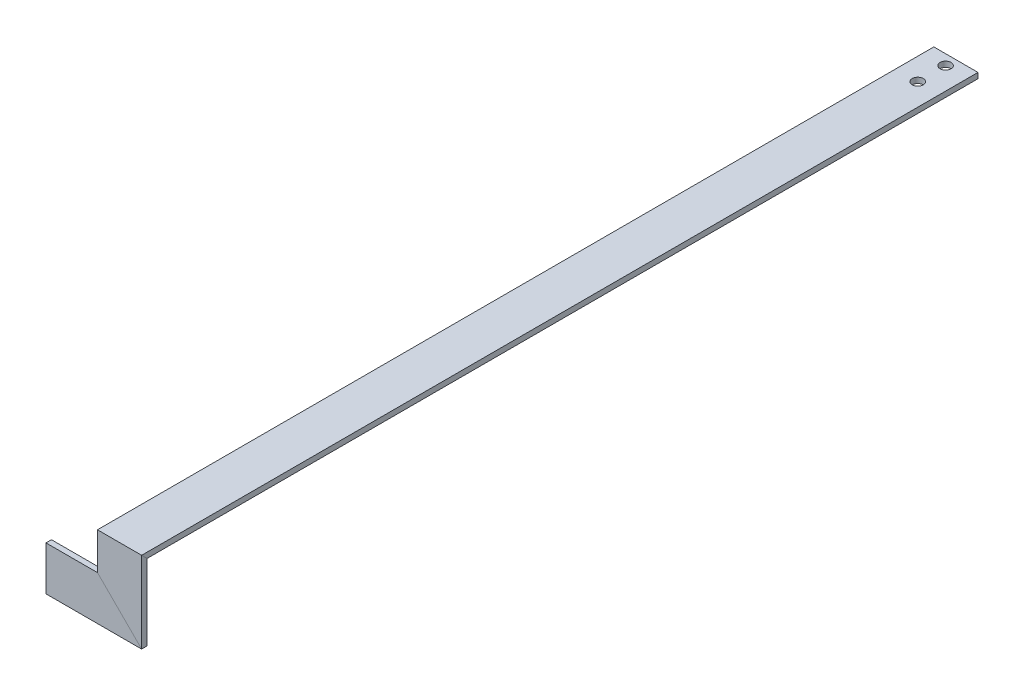
ISO-10303-21;
HEADER;
FILE_DESCRIPTION(('STEP AP214'),'2;1');
FILE_NAME('part.step','',(''),(''),'','','');
FILE_SCHEMA(('AUTOMOTIVE_DESIGN { 1 0 10303 214 1 1 1 1 }'));
ENDSEC;
DATA;
#1=APPLICATION_CONTEXT('core data for automotive mechanical design processes');
#2=APPLICATION_PROTOCOL_DEFINITION('international standard','automotive_design',2000,#1);
#3=PRODUCT_CONTEXT('',#1,'mechanical');
#4=PRODUCT('Part','Part','',(#3));
#5=PRODUCT_RELATED_PRODUCT_CATEGORY('part','',(#4));
#6=PRODUCT_DEFINITION_FORMATION('','',#4);
#7=PRODUCT_DEFINITION_CONTEXT('part definition',#1,'design');
#8=PRODUCT_DEFINITION('design','',#6,#7);
#9=PRODUCT_DEFINITION_SHAPE('','',#8);
#10=(LENGTH_UNIT() NAMED_UNIT(*) SI_UNIT(.MILLI.,.METRE.));
#11=(NAMED_UNIT(*) PLANE_ANGLE_UNIT() SI_UNIT($,.RADIAN.));
#12=(NAMED_UNIT(*) SI_UNIT($,.STERADIAN.) SOLID_ANGLE_UNIT());
#13=UNCERTAINTY_MEASURE_WITH_UNIT(LENGTH_MEASURE(1.E-05),#10,'distance_accuracy_value','');
#14=(GEOMETRIC_REPRESENTATION_CONTEXT(3) GLOBAL_UNCERTAINTY_ASSIGNED_CONTEXT((#13)) GLOBAL_UNIT_ASSIGNED_CONTEXT((#10,
#11,#12)) REPRESENTATION_CONTEXT('',''));
#15=CARTESIAN_POINT('',(0.,0.,0.));
#16=DIRECTION('',(0.,0.,1.));
#17=DIRECTION('',(1.,0.,0.));
#18=AXIS2_PLACEMENT_3D('',#15,#16,#17);
#19=CARTESIAN_POINT('',(-84.5999999999998,-64.9,958.84));
#20=DIRECTION('',(-1.,0.,0.));
#21=DIRECTION('',(0.,-1.,0.));
#22=AXIS2_PLACEMENT_3D('',#19,#20,#21);
#23=PLANE('',#22);
#24=DIRECTION('',(0.,0.,1.));
#25=VECTOR('',#24,1.);
#26=CARTESIAN_POINT('',(-84.5999999999998,-90.3,961.995));
#27=LINE('',#26,#25);
#28=CARTESIAN_POINT('',(-84.5999999999998,-90.3,955.685));
#29=VERTEX_POINT('',#28);
#30=CARTESIAN_POINT('',(-84.5999999999998,-90.3,961.995));
#31=VERTEX_POINT('',#30);
#32=EDGE_CURVE('E84',#29,#31,#27,.T.);
#33=ORIENTED_EDGE('',*,*,#32,.T.);
#34=DIRECTION('',(0.,1.,0.));
#35=VECTOR('',#34,1.);
#36=CARTESIAN_POINT('',(-84.5999999999998,-39.5,961.995));
#37=LINE('',#36,#35);
#38=CARTESIAN_POINT('',(-84.5999999999998,-39.5,961.995));
#39=VERTEX_POINT('',#38);
#40=EDGE_CURVE('E82',#31,#39,#37,.T.);
#41=ORIENTED_EDGE('',*,*,#40,.T.);
#42=DIRECTION('',(0.,0.,-1.));
#43=VECTOR('',#42,1.);
#44=CARTESIAN_POINT('',(-84.5999999999998,-39.5,961.995));
#45=LINE('',#44,#43);
#46=CARTESIAN_POINT('',(-84.5999999999998,-39.5,955.685));
#47=VERTEX_POINT('',#46);
#48=EDGE_CURVE('E79',#39,#47,#45,.T.);
#49=ORIENTED_EDGE('',*,*,#48,.T.);
#50=DIRECTION('',(0.,-1.,0.));
#51=VECTOR('',#50,1.);
#52=CARTESIAN_POINT('',(-84.5999999999998,-39.5,955.685));
#53=LINE('',#52,#51);
#54=EDGE_CURVE('E99',#47,#29,#53,.T.);
#55=ORIENTED_EDGE('',*,*,#54,.T.);
#56=EDGE_LOOP('',(#33,#41,#49,#55));
#57=FACE_BOUND('',#56,.T.);
#58=ADVANCED_FACE('F33',(#57),#23,.T.);
#59=CARTESIAN_POINT('',(0.,0.,0.));
#60=DIRECTION('',(0.,0.,1.));
#61=DIRECTION('',(1.,0.,0.));
#62=AXIS2_PLACEMENT_3D('',#59,#60,#61);
#63=PLANE('',#62);
#64=DIRECTION('',(0.,1.,0.));
#65=VECTOR('',#64,1.);
#66=CARTESIAN_POINT('',(25.4,3.155,0.));
#67=LINE('',#66,#65);
#68=CARTESIAN_POINT('',(25.4,-3.155,0.));
#69=VERTEX_POINT('',#68);
#70=CARTESIAN_POINT('',(25.4,3.155,0.));
#71=VERTEX_POINT('',#70);
#72=EDGE_CURVE('E141',#69,#71,#67,.T.);
#73=ORIENTED_EDGE('',*,*,#72,.F.);
#74=DIRECTION('',(1.,0.,0.));
#75=VECTOR('',#74,1.);
#76=CARTESIAN_POINT('',(-25.4,-3.155,0.));
#77=LINE('',#76,#75);
#78=CARTESIAN_POINT('',(-25.4,-3.155,0.));
#79=VERTEX_POINT('',#78);
#80=EDGE_CURVE('E147',#79,#69,#77,.T.);
#81=ORIENTED_EDGE('',*,*,#80,.F.);
#82=DIRECTION('',(0.,-1.,0.));
#83=VECTOR('',#82,1.);
#84=CARTESIAN_POINT('',(-25.4,3.155,0.));
#85=LINE('',#84,#83);
#86=CARTESIAN_POINT('',(-25.4,3.155,0.));
#87=VERTEX_POINT('',#86);
#88=EDGE_CURVE('E131',#87,#79,#85,.T.);
#89=ORIENTED_EDGE('',*,*,#88,.F.);
#90=DIRECTION('',(-1.,0.,0.));
#91=VECTOR('',#90,1.);
#92=CARTESIAN_POINT('',(-25.4,3.155,0.));
#93=LINE('',#92,#91);
#94=EDGE_CURVE('E137',#71,#87,#93,.T.);
#95=ORIENTED_EDGE('',*,*,#94,.F.);
#96=EDGE_LOOP('',(#73,#81,#89,#95));
#97=FACE_BOUND('',#96,.T.);
#98=ADVANCED_FACE('F334',(#97),#63,.F.);
#99=CARTESIAN_POINT('',(28.04,-39.5,961.995));
#100=DIRECTION('',(0.,1.,0.));
#101=DIRECTION('',(0.,0.,1.));
#102=AXIS2_PLACEMENT_3D('',#99,#100,#101);
#103=PLANE('',#102);
#104=DIRECTION('',(0.,0.,1.));
#105=VECTOR('',#104,1.);
#106=CARTESIAN_POINT('',(-25.4,-39.5,961.995));
#107=LINE('',#106,#105);
#108=CARTESIAN_POINT('',(-25.4,-39.5,955.685));
#109=VERTEX_POINT('',#108);
#110=CARTESIAN_POINT('',(-25.4,-39.5,961.995));
#111=VERTEX_POINT('',#110);
#112=EDGE_CURVE('E115',#109,#111,#107,.T.);
#113=ORIENTED_EDGE('',*,*,#112,.F.);
#114=DIRECTION('',(-1.,0.,0.));
#115=VECTOR('',#114,1.);
#116=CARTESIAN_POINT('',(28.04,-39.5,955.685));
#117=LINE('',#116,#115);
#118=EDGE_CURVE('E97',#109,#47,#117,.T.);
#119=ORIENTED_EDGE('',*,*,#118,.T.);
#120=ORIENTED_EDGE('',*,*,#48,.F.);
#121=DIRECTION('',(-1.,0.,0.));
#122=VECTOR('',#121,1.);
#123=CARTESIAN_POINT('',(28.04,-39.5,961.995));
#124=LINE('',#123,#122);
#125=EDGE_CURVE('E36',#111,#39,#124,.T.);
#126=ORIENTED_EDGE('',*,*,#125,.F.);
#127=EDGE_LOOP('',(#113,#119,#120,#126));
#128=FACE_BOUND('',#127,.T.);
#129=ADVANCED_FACE('F94',(#128),#103,.T.);
#130=CARTESIAN_POINT('',(28.04,-39.5,955.685));
#131=DIRECTION('',(0.,0.,-1.));
#132=DIRECTION('',(-1.,0.,0.));
#133=AXIS2_PLACEMENT_3D('',#130,#131,#132);
#134=PLANE('',#133);
#135=DIRECTION('',(-0.707106781186548,0.707106781186548,0.));
#136=VECTOR('',#135,1.);
#137=CARTESIAN_POINT('',(-46.93525,-17.96475,955.685));
#138=LINE('',#137,#136);
#139=CARTESIAN_POINT('',(25.4,-90.3,955.685));
#140=VERTEX_POINT('',#139);
#141=EDGE_CURVE('E128',#140,#109,#138,.T.);
#142=ORIENTED_EDGE('',*,*,#141,.F.);
#143=DIRECTION('',(-1.,0.,0.));
#144=VECTOR('',#143,1.);
#145=CARTESIAN_POINT('',(28.04,-90.3,955.685));
#146=LINE('',#145,#144);
#147=EDGE_CURVE('E108',#140,#29,#146,.T.);
#148=ORIENTED_EDGE('',*,*,#147,.T.);
#149=ORIENTED_EDGE('',*,*,#54,.F.);
#150=ORIENTED_EDGE('',*,*,#118,.F.);
#151=EDGE_LOOP('',(#142,#148,#149,#150));
#152=FACE_BOUND('',#151,.T.);
#153=ADVANCED_FACE('F317',(#152),#134,.T.);
#154=CARTESIAN_POINT('',(28.04,-90.3,961.995));
#155=DIRECTION('',(0.,-1.,0.));
#156=DIRECTION('',(0.,0.,-1.));
#157=AXIS2_PLACEMENT_3D('',#154,#155,#156);
#158=PLANE('',#157);
#159=DIRECTION('',(0.,0.,-1.));
#160=VECTOR('',#159,1.);
#161=CARTESIAN_POINT('',(25.4,-90.3,961.995));
#162=LINE('',#161,#160);
#163=CARTESIAN_POINT('',(25.4,-90.3,961.995));
#164=VERTEX_POINT('',#163);
#165=EDGE_CURVE('E125',#164,#140,#162,.T.);
#166=ORIENTED_EDGE('',*,*,#165,.F.);
#167=DIRECTION('',(-1.,0.,0.));
#168=VECTOR('',#167,1.);
#169=CARTESIAN_POINT('',(28.04,-90.3,961.995));
#170=LINE('',#169,#168);
#171=EDGE_CURVE('E98',#164,#31,#170,.T.);
#172=ORIENTED_EDGE('',*,*,#171,.T.);
#173=ORIENTED_EDGE('',*,*,#32,.F.);
#174=ORIENTED_EDGE('',*,*,#147,.F.);
#175=EDGE_LOOP('',(#166,#172,#173,#174));
#176=FACE_BOUND('',#175,.T.);
#177=ADVANCED_FACE('F232',(#176),#158,.T.);
#178=CARTESIAN_POINT('',(28.04,-39.5,961.995));
#179=DIRECTION('',(0.,0.,1.));
#180=DIRECTION('',(1.,0.,0.));
#181=AXIS2_PLACEMENT_3D('',#178,#179,#180);
#182=PLANE('',#181);
#183=DIRECTION('',(0.707106781186548,-0.707106781186548,0.));
#184=VECTOR('',#183,1.);
#185=CARTESIAN_POINT('',(-46.93525,-17.96475,961.995));
#186=LINE('',#185,#184);
#187=EDGE_CURVE('E103',#111,#164,#186,.T.);
#188=ORIENTED_EDGE('',*,*,#187,.F.);
#189=ORIENTED_EDGE('',*,*,#125,.T.);
#190=ORIENTED_EDGE('',*,*,#40,.F.);
#191=ORIENTED_EDGE('',*,*,#171,.F.);
#192=EDGE_LOOP('',(#188,#189,#190,#191));
#193=FACE_BOUND('',#192,.T.);
#194=ADVANCED_FACE('F101',(#193),#182,.T.);
#195=CARTESIAN_POINT('',(-25.4,3.5705,961.995));
#196=DIRECTION('',(0.,0.,1.));
#197=DIRECTION('',(1.,0.,0.));
#198=AXIS2_PLACEMENT_3D('',#195,#196,#197);
#199=PLANE('',#198);
#200=DIRECTION('',(0.,-1.,0.));
#201=VECTOR('',#200,1.);
#202=CARTESIAN_POINT('',(-25.4,3.5705,961.995));
#203=LINE('',#202,#201);
#204=CARTESIAN_POINT('',(-25.4,3.15500000000006,961.995));
#205=VERTEX_POINT('',#204);
#206=EDGE_CURVE('E117',#205,#111,#203,.T.);
#207=ORIENTED_EDGE('',*,*,#206,.T.);
#208=ORIENTED_EDGE('',*,*,#187,.T.);
#209=DIRECTION('',(0.,-1.,0.));
#210=VECTOR('',#209,1.);
#211=CARTESIAN_POINT('',(25.4,3.5705,961.995));
#212=LINE('',#211,#210);
#213=CARTESIAN_POINT('',(25.4,3.15500000000006,961.995));
#214=VERTEX_POINT('',#213);
#215=EDGE_CURVE('E104',#214,#164,#212,.T.);
#216=ORIENTED_EDGE('',*,*,#215,.F.);
#217=DIRECTION('',(1.,0.,0.));
#218=VECTOR('',#217,1.);
#219=CARTESIAN_POINT('',(-25.4,3.155,961.995));
#220=LINE('',#219,#218);
#221=EDGE_CURVE('E135',#205,#214,#220,.T.);
#222=ORIENTED_EDGE('',*,*,#221,.F.);
#223=EDGE_LOOP('',(#207,#208,#216,#222));
#224=FACE_BOUND('',#223,.T.);
#225=ADVANCED_FACE('F224',(#224),#199,.T.);
#226=CARTESIAN_POINT('',(25.4,3.5705,961.995));
#227=DIRECTION('',(1.,0.,0.));
#228=DIRECTION('',(0.,0.,-1.));
#229=AXIS2_PLACEMENT_3D('',#226,#227,#228);
#230=PLANE('',#229);
#231=ORIENTED_EDGE('',*,*,#215,.T.);
#232=ORIENTED_EDGE('',*,*,#165,.T.);
#233=DIRECTION('',(0.,-1.,0.));
#234=VECTOR('',#233,1.);
#235=CARTESIAN_POINT('',(25.4,3.5705,955.685));
#236=LINE('',#235,#234);
#237=CARTESIAN_POINT('',(25.4,-3.15500000000001,955.685));
#238=VERTEX_POINT('',#237);
#239=EDGE_CURVE('E106',#238,#140,#236,.T.);
#240=ORIENTED_EDGE('',*,*,#239,.F.);
#241=DIRECTION('',(0.,-0.707106781186548,-0.707106781186548));
#242=VECTOR('',#241,1.);
#243=CARTESIAN_POINT('',(25.4,-477.8425,480.9975));
#244=LINE('',#243,#242);
#245=EDGE_CURVE('E42',#214,#238,#244,.T.);
#246=ORIENTED_EDGE('',*,*,#245,.F.);
#247=EDGE_LOOP('',(#231,#232,#240,#246));
#248=FACE_BOUND('',#247,.T.);
#249=ADVANCED_FACE('F222',(#248),#230,.T.);
#250=CARTESIAN_POINT('',(-25.4,3.5705,955.685));
#251=DIRECTION('',(0.,0.,-1.));
#252=DIRECTION('',(-1.,0.,0.));
#253=AXIS2_PLACEMENT_3D('',#250,#251,#252);
#254=PLANE('',#253);
#255=ORIENTED_EDGE('',*,*,#239,.T.);
#256=ORIENTED_EDGE('',*,*,#141,.T.);
#257=DIRECTION('',(0.,-1.,0.));
#258=VECTOR('',#257,1.);
#259=CARTESIAN_POINT('',(-25.4,3.5705,955.685));
#260=LINE('',#259,#258);
#261=CARTESIAN_POINT('',(-25.4,-3.15499999999998,955.685));
#262=VERTEX_POINT('',#261);
#263=EDGE_CURVE('E120',#262,#109,#260,.T.);
#264=ORIENTED_EDGE('',*,*,#263,.F.);
#265=DIRECTION('',(-1.,0.,0.));
#266=VECTOR('',#265,1.);
#267=CARTESIAN_POINT('',(-25.4,-3.155,955.685));
#268=LINE('',#267,#266);
#269=EDGE_CURVE('E11',#238,#262,#268,.T.);
#270=ORIENTED_EDGE('',*,*,#269,.F.);
#271=EDGE_LOOP('',(#255,#256,#264,#270));
#272=FACE_BOUND('',#271,.T.);
#273=ADVANCED_FACE('F216',(#272),#254,.T.);
#274=CARTESIAN_POINT('',(-25.4,3.5705,961.995));
#275=DIRECTION('',(-1.,0.,0.));
#276=DIRECTION('',(0.,0.,1.));
#277=AXIS2_PLACEMENT_3D('',#274,#275,#276);
#278=PLANE('',#277);
#279=ORIENTED_EDGE('',*,*,#263,.T.);
#280=ORIENTED_EDGE('',*,*,#112,.T.);
#281=ORIENTED_EDGE('',*,*,#206,.F.);
#282=DIRECTION('',(0.,0.707106781186548,0.707106781186548));
#283=VECTOR('',#282,1.);
#284=CARTESIAN_POINT('',(-25.4,-477.8425,480.9975));
#285=LINE('',#284,#283);
#286=EDGE_CURVE('E132',#262,#205,#285,.T.);
#287=ORIENTED_EDGE('',*,*,#286,.F.);
#288=EDGE_LOOP('',(#279,#280,#281,#287));
#289=FACE_BOUND('',#288,.T.);
#290=ADVANCED_FACE('F189',(#289),#278,.T.);
#291=CARTESIAN_POINT('',(-25.4,3.155,0.));
#292=DIRECTION('',(0.,1.,0.));
#293=DIRECTION('',(0.,0.,1.));
#294=AXIS2_PLACEMENT_3D('',#291,#292,#293);
#295=PLANE('',#294);
#296=CARTESIAN_POINT('',(6.7168492989822E-12,3.155,11.892204665723));
#297=DIRECTION('',(0.,1.,0.));
#298=DIRECTION('',(0.,0.,1.));
#299=AXIS2_PLACEMENT_3D('',#296,#297,#298);
#300=CIRCLE('',#299,6.35000000000002);
#301=CARTESIAN_POINT('',(6.7168492989822E-12,3.155,18.2422046657231));
#302=VERTEX_POINT('',#301);
#303=EDGE_CURVE('E169',#302,#302,#300,.T.);
#304=ORIENTED_EDGE('',*,*,#303,.F.);
#305=EDGE_LOOP('',(#304));
#306=FACE_BOUND('',#305,.T.);
#307=CARTESIAN_POINT('',(6.82787160144471E-12,3.155,43.8922046657231));
#308=DIRECTION('',(0.,1.,0.));
#309=DIRECTION('',(0.,0.,1.));
#310=AXIS2_PLACEMENT_3D('',#307,#308,#309);
#311=CIRCLE('',#310,6.35000000000002);
#312=CARTESIAN_POINT('',(6.82787160144471E-12,3.155,50.2422046657231));
#313=VERTEX_POINT('',#312);
#314=EDGE_CURVE('E163',#313,#313,#311,.T.);
#315=ORIENTED_EDGE('',*,*,#314,.F.);
#316=EDGE_LOOP('',(#315));
#317=FACE_BOUND('',#316,.T.);
#318=DIRECTION('',(0.,0.,1.));
#319=VECTOR('',#318,1.);
#320=CARTESIAN_POINT('',(-25.4,3.155,0.));
#321=LINE('',#320,#319);
#322=EDGE_CURVE('E140',#87,#205,#321,.T.);
#323=ORIENTED_EDGE('',*,*,#322,.T.);
#324=ORIENTED_EDGE('',*,*,#221,.T.);
#325=DIRECTION('',(0.,0.,1.));
#326=VECTOR('',#325,1.);
#327=CARTESIAN_POINT('',(25.4,3.155,0.));
#328=LINE('',#327,#326);
#329=EDGE_CURVE('E136',#71,#214,#328,.T.);
#330=ORIENTED_EDGE('',*,*,#329,.F.);
#331=ORIENTED_EDGE('',*,*,#94,.T.);
#332=EDGE_LOOP('',(#323,#324,#330,#331));
#333=FACE_BOUND('',#332,.T.);
#334=ADVANCED_FACE('F185',(#306,#317,#333),#295,.T.);
#335=CARTESIAN_POINT('',(25.4,3.155,0.));
#336=DIRECTION('',(1.,0.,0.));
#337=DIRECTION('',(0.,0.,-1.));
#338=AXIS2_PLACEMENT_3D('',#335,#336,#337);
#339=PLANE('',#338);
#340=ORIENTED_EDGE('',*,*,#329,.T.);
#341=ORIENTED_EDGE('',*,*,#245,.T.);
#342=DIRECTION('',(0.,0.,1.));
#343=VECTOR('',#342,1.);
#344=CARTESIAN_POINT('',(25.4,-3.155,0.));
#345=LINE('',#344,#343);
#346=EDGE_CURVE('E144',#69,#238,#345,.T.);
#347=ORIENTED_EDGE('',*,*,#346,.F.);
#348=ORIENTED_EDGE('',*,*,#72,.T.);
#349=EDGE_LOOP('',(#340,#341,#347,#348));
#350=FACE_BOUND('',#349,.T.);
#351=ADVANCED_FACE('F188',(#350),#339,.T.);
#352=CARTESIAN_POINT('',(-25.4,-3.155,0.));
#353=DIRECTION('',(0.,-1.,0.));
#354=DIRECTION('',(0.,0.,-1.));
#355=AXIS2_PLACEMENT_3D('',#352,#353,#354);
#356=PLANE('',#355);
#357=CARTESIAN_POINT('',(6.7168492989822E-12,-3.155,11.892204665723));
#358=DIRECTION('',(0.,1.,0.));
#359=DIRECTION('',(0.,0.,1.));
#360=AXIS2_PLACEMENT_3D('',#357,#358,#359);
#361=CIRCLE('',#360,6.35000000000002);
#362=CARTESIAN_POINT('',(6.7168492989822E-12,-3.155,18.2422046657231));
#363=VERTEX_POINT('',#362);
#364=EDGE_CURVE('E166',#363,#363,#361,.T.);
#365=ORIENTED_EDGE('',*,*,#364,.T.);
#366=EDGE_LOOP('',(#365));
#367=FACE_BOUND('',#366,.T.);
#368=CARTESIAN_POINT('',(6.82787160144471E-12,-3.155,43.8922046657231));
#369=DIRECTION('',(0.,1.,0.));
#370=DIRECTION('',(0.,0.,1.));
#371=AXIS2_PLACEMENT_3D('',#368,#369,#370);
#372=CIRCLE('',#371,6.35000000000002);
#373=CARTESIAN_POINT('',(6.82787160144471E-12,-3.155,50.2422046657231));
#374=VERTEX_POINT('',#373);
#375=EDGE_CURVE('E89',#374,#374,#372,.T.);
#376=ORIENTED_EDGE('',*,*,#375,.T.);
#377=EDGE_LOOP('',(#376));
#378=FACE_BOUND('',#377,.T.);
#379=ORIENTED_EDGE('',*,*,#346,.T.);
#380=ORIENTED_EDGE('',*,*,#269,.T.);
#381=DIRECTION('',(0.,0.,1.));
#382=VECTOR('',#381,1.);
#383=CARTESIAN_POINT('',(-25.4,-3.155,0.));
#384=LINE('',#383,#382);
#385=EDGE_CURVE('E150',#79,#262,#384,.T.);
#386=ORIENTED_EDGE('',*,*,#385,.F.);
#387=ORIENTED_EDGE('',*,*,#80,.T.);
#388=EDGE_LOOP('',(#379,#380,#386,#387));
#389=FACE_BOUND('',#388,.T.);
#390=ADVANCED_FACE('F175',(#367,#378,#389),#356,.T.);
#391=CARTESIAN_POINT('',(-25.4,3.155,0.));
#392=DIRECTION('',(-1.,0.,0.));
#393=DIRECTION('',(0.,0.,1.));
#394=AXIS2_PLACEMENT_3D('',#391,#392,#393);
#395=PLANE('',#394);
#396=ORIENTED_EDGE('',*,*,#385,.T.);
#397=ORIENTED_EDGE('',*,*,#286,.T.);
#398=ORIENTED_EDGE('',*,*,#322,.F.);
#399=ORIENTED_EDGE('',*,*,#88,.T.);
#400=EDGE_LOOP('',(#396,#397,#398,#399));
#401=FACE_BOUND('',#400,.T.);
#402=ADVANCED_FACE('F199',(#401),#395,.T.);
#403=CARTESIAN_POINT('',(6.82787160144471E-12,-3.155,43.8922046657231));
#404=DIRECTION('',(0.,1.,0.));
#405=DIRECTION('',(0.,0.,1.));
#406=AXIS2_PLACEMENT_3D('',#403,#404,#405);
#407=CYLINDRICAL_SURFACE('',#406,6.35000000000002);
#408=ORIENTED_EDGE('',*,*,#375,.F.);
#409=EDGE_LOOP('',(#408));
#410=FACE_BOUND('',#409,.T.);
#411=ORIENTED_EDGE('',*,*,#314,.T.);
#412=EDGE_LOOP('',(#411));
#413=FACE_BOUND('',#412,.T.);
#414=ADVANCED_FACE('F181',(#410,#413),#407,.F.);
#415=CARTESIAN_POINT('',(6.7168492989822E-12,-3.155,11.892204665723));
#416=DIRECTION('',(0.,1.,0.));
#417=DIRECTION('',(0.,0.,1.));
#418=AXIS2_PLACEMENT_3D('',#415,#416,#417);
#419=CYLINDRICAL_SURFACE('',#418,6.35000000000002);
#420=ORIENTED_EDGE('',*,*,#364,.F.);
#421=EDGE_LOOP('',(#420));
#422=FACE_BOUND('',#421,.T.);
#423=ORIENTED_EDGE('',*,*,#303,.T.);
#424=EDGE_LOOP('',(#423));
#425=FACE_BOUND('',#424,.T.);
#426=ADVANCED_FACE('F178',(#422,#425),#419,.F.);
#427=CLOSED_SHELL('',(#58,#98,#129,#153,#177,#194,#225,#249,#273,#290,#334,#351,#390,#402,#414,#426));
#428=MANIFOLD_SOLID_BREP('B2',#427);
#429=ADVANCED_BREP_SHAPE_REPRESENTATION('',(#18,#428),#14);
#430=SHAPE_DEFINITION_REPRESENTATION(#9,#429);
ENDSEC;
END-ISO-10303-21;
